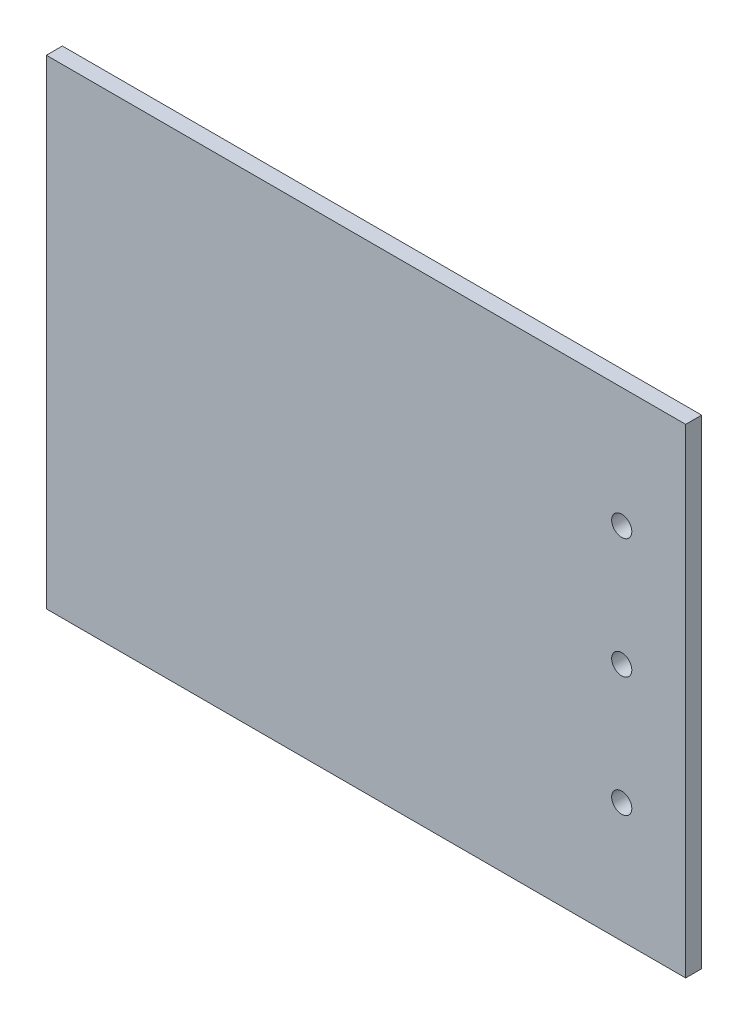
ISO-10303-21;
HEADER;
FILE_DESCRIPTION(('STEP AP214'),'2;1');
FILE_NAME('part.step','',(''),(''),'','','');
FILE_SCHEMA(('AUTOMOTIVE_DESIGN { 1 0 10303 214 1 1 1 1 }'));
ENDSEC;
DATA;
#1=APPLICATION_CONTEXT('core data for automotive mechanical design processes');
#2=APPLICATION_PROTOCOL_DEFINITION('international standard','automotive_design',2000,#1);
#3=PRODUCT_CONTEXT('',#1,'mechanical');
#4=PRODUCT('Part','Part','',(#3));
#5=PRODUCT_RELATED_PRODUCT_CATEGORY('part','',(#4));
#6=PRODUCT_DEFINITION_FORMATION('','',#4);
#7=PRODUCT_DEFINITION_CONTEXT('part definition',#1,'design');
#8=PRODUCT_DEFINITION('design','',#6,#7);
#9=PRODUCT_DEFINITION_SHAPE('','',#8);
#10=(LENGTH_UNIT() NAMED_UNIT(*) SI_UNIT(.MILLI.,.METRE.));
#11=(NAMED_UNIT(*) PLANE_ANGLE_UNIT() SI_UNIT($,.RADIAN.));
#12=(NAMED_UNIT(*) SI_UNIT($,.STERADIAN.) SOLID_ANGLE_UNIT());
#13=UNCERTAINTY_MEASURE_WITH_UNIT(LENGTH_MEASURE(1.E-05),#10,'distance_accuracy_value','');
#14=(GEOMETRIC_REPRESENTATION_CONTEXT(3) GLOBAL_UNCERTAINTY_ASSIGNED_CONTEXT((#13)) GLOBAL_UNIT_ASSIGNED_CONTEXT((#10,
#11,#12)) REPRESENTATION_CONTEXT('',''));
#15=CARTESIAN_POINT('',(0.,0.,0.));
#16=DIRECTION('',(0.,0.,1.));
#17=DIRECTION('',(1.,0.,0.));
#18=AXIS2_PLACEMENT_3D('',#15,#16,#17);
#19=CARTESIAN_POINT('',(-23.5847584963962,0.,5.));
#20=DIRECTION('',(0.,-1.,0.));
#21=DIRECTION('',(1.,0.,0.));
#22=AXIS2_PLACEMENT_3D('',#19,#20,#21);
#23=PLANE('',#22);
#24=DIRECTION('',(-1.,0.,0.));
#25=VECTOR('',#24,1.);
#26=CARTESIAN_POINT('',(-23.5847584963962,0.,0.));
#27=LINE('',#26,#25);
#28=CARTESIAN_POINT('',(-23.5847584963962,0.,0.));
#29=VERTEX_POINT('',#28);
#30=CARTESIAN_POINT('',(-223.584758496396,0.,0.));
#31=VERTEX_POINT('',#30);
#32=EDGE_CURVE('E109',#29,#31,#27,.T.);
#33=ORIENTED_EDGE('',*,*,#32,.T.);
#34=DIRECTION('',(0.,0.,-1.));
#35=VECTOR('',#34,1.);
#36=CARTESIAN_POINT('',(-223.584758496396,0.,5.));
#37=LINE('',#36,#35);
#38=CARTESIAN_POINT('',(-223.584758496396,0.,5.));
#39=VERTEX_POINT('',#38);
#40=EDGE_CURVE('E11',#39,#31,#37,.T.);
#41=ORIENTED_EDGE('',*,*,#40,.F.);
#42=DIRECTION('',(-1.,0.,0.));
#43=VECTOR('',#42,1.);
#44=CARTESIAN_POINT('',(-23.5847584963962,0.,5.));
#45=LINE('',#44,#43);
#46=CARTESIAN_POINT('',(-23.5847584963962,0.,5.));
#47=VERTEX_POINT('',#46);
#48=EDGE_CURVE('E91',#47,#39,#45,.T.);
#49=ORIENTED_EDGE('',*,*,#48,.F.);
#50=DIRECTION('',(0.,0.,-1.));
#51=VECTOR('',#50,1.);
#52=CARTESIAN_POINT('',(-23.5847584963962,0.,5.));
#53=LINE('',#52,#51);
#54=EDGE_CURVE('E56',#47,#29,#53,.T.);
#55=ORIENTED_EDGE('',*,*,#54,.T.);
#56=EDGE_LOOP('',(#33,#41,#49,#55));
#57=FACE_BOUND('',#56,.T.);
#58=ADVANCED_FACE('F39',(#57),#23,.F.);
#59=CARTESIAN_POINT('',(-223.584758496396,0.,5.));
#60=DIRECTION('',(1.,0.,0.));
#61=DIRECTION('',(0.,0.,-1.));
#62=AXIS2_PLACEMENT_3D('',#59,#60,#61);
#63=PLANE('',#62);
#64=DIRECTION('',(0.,-1.,0.));
#65=VECTOR('',#64,1.);
#66=CARTESIAN_POINT('',(-223.584758496396,0.,0.));
#67=LINE('',#66,#65);
#68=CARTESIAN_POINT('',(-223.584758496396,-150.,0.));
#69=VERTEX_POINT('',#68);
#70=EDGE_CURVE('E97',#31,#69,#67,.T.);
#71=ORIENTED_EDGE('',*,*,#70,.T.);
#72=DIRECTION('',(0.,0.,-1.));
#73=VECTOR('',#72,1.);
#74=CARTESIAN_POINT('',(-223.584758496396,-150.,5.));
#75=LINE('',#74,#73);
#76=CARTESIAN_POINT('',(-223.584758496396,-150.,5.));
#77=VERTEX_POINT('',#76);
#78=EDGE_CURVE('E48',#77,#69,#75,.T.);
#79=ORIENTED_EDGE('',*,*,#78,.F.);
#80=DIRECTION('',(0.,-1.,0.));
#81=VECTOR('',#80,1.);
#82=CARTESIAN_POINT('',(-223.584758496396,0.,5.));
#83=LINE('',#82,#81);
#84=EDGE_CURVE('E83',#39,#77,#83,.T.);
#85=ORIENTED_EDGE('',*,*,#84,.F.);
#86=ORIENTED_EDGE('',*,*,#40,.T.);
#87=EDGE_LOOP('',(#71,#79,#85,#86));
#88=FACE_BOUND('',#87,.T.);
#89=ADVANCED_FACE('F96',(#88),#63,.F.);
#90=CARTESIAN_POINT('',(-23.5847584963962,-150.,5.));
#91=DIRECTION('',(0.,-1.,0.));
#92=DIRECTION('',(1.,0.,0.));
#93=AXIS2_PLACEMENT_3D('',#90,#91,#92);
#94=PLANE('',#93);
#95=DIRECTION('',(-1.,0.,0.));
#96=VECTOR('',#95,1.);
#97=CARTESIAN_POINT('',(-23.5847584963962,-150.,0.));
#98=LINE('',#97,#96);
#99=CARTESIAN_POINT('',(-23.5847584963962,-150.,0.));
#100=VERTEX_POINT('',#99);
#101=EDGE_CURVE('E115',#100,#69,#98,.T.);
#102=ORIENTED_EDGE('',*,*,#101,.F.);
#103=DIRECTION('',(0.,0.,-1.));
#104=VECTOR('',#103,1.);
#105=CARTESIAN_POINT('',(-23.5847584963962,-150.,5.));
#106=LINE('',#105,#104);
#107=CARTESIAN_POINT('',(-23.5847584963962,-150.,5.));
#108=VERTEX_POINT('',#107);
#109=EDGE_CURVE('E71',#108,#100,#106,.T.);
#110=ORIENTED_EDGE('',*,*,#109,.F.);
#111=DIRECTION('',(-1.,0.,0.));
#112=VECTOR('',#111,1.);
#113=CARTESIAN_POINT('',(-23.5847584963962,-150.,5.));
#114=LINE('',#113,#112);
#115=EDGE_CURVE('E90',#108,#77,#114,.T.);
#116=ORIENTED_EDGE('',*,*,#115,.T.);
#117=ORIENTED_EDGE('',*,*,#78,.T.);
#118=EDGE_LOOP('',(#102,#110,#116,#117));
#119=FACE_BOUND('',#118,.T.);
#120=ADVANCED_FACE('F100',(#119),#94,.T.);
#121=CARTESIAN_POINT('',(-23.5847584963962,0.,5.));
#122=DIRECTION('',(1.,0.,0.));
#123=DIRECTION('',(0.,1.,0.));
#124=AXIS2_PLACEMENT_3D('',#121,#122,#123);
#125=PLANE('',#124);
#126=DIRECTION('',(0.,-1.,0.));
#127=VECTOR('',#126,1.);
#128=CARTESIAN_POINT('',(-23.5847584963962,0.,0.));
#129=LINE('',#128,#127);
#130=EDGE_CURVE('E117',#29,#100,#129,.T.);
#131=ORIENTED_EDGE('',*,*,#130,.F.);
#132=ORIENTED_EDGE('',*,*,#54,.F.);
#133=DIRECTION('',(0.,-1.,0.));
#134=VECTOR('',#133,1.);
#135=CARTESIAN_POINT('',(-23.5847584963962,0.,5.));
#136=LINE('',#135,#134);
#137=EDGE_CURVE('E102',#47,#108,#136,.T.);
#138=ORIENTED_EDGE('',*,*,#137,.T.);
#139=ORIENTED_EDGE('',*,*,#109,.T.);
#140=EDGE_LOOP('',(#131,#132,#138,#139));
#141=FACE_BOUND('',#140,.T.);
#142=ADVANCED_FACE('F166',(#141),#125,.T.);
#143=CARTESIAN_POINT('',(0.,0.,5.));
#144=DIRECTION('',(0.,0.,1.));
#145=DIRECTION('',(1.,0.,0.));
#146=AXIS2_PLACEMENT_3D('',#143,#144,#145);
#147=PLANE('',#146);
#148=CARTESIAN_POINT('',(-43.5847584963962,-37.4999999999999,5.));
#149=DIRECTION('',(0.,0.,-1.));
#150=DIRECTION('',(-1.,0.,0.));
#151=AXIS2_PLACEMENT_3D('',#148,#149,#150);
#152=CIRCLE('',#151,3.15);
#153=CARTESIAN_POINT('',(-46.7347584963962,-37.4999999999999,5.));
#154=VERTEX_POINT('',#153);
#155=EDGE_CURVE('E112',#154,#154,#152,.T.);
#156=ORIENTED_EDGE('',*,*,#155,.T.);
#157=EDGE_LOOP('',(#156));
#158=FACE_BOUND('',#157,.T.);
#159=CARTESIAN_POINT('',(-43.5847584963962,-74.9999999999999,5.));
#160=DIRECTION('',(0.,0.,-1.));
#161=DIRECTION('',(-1.,0.,0.));
#162=AXIS2_PLACEMENT_3D('',#159,#160,#161);
#163=CIRCLE('',#162,3.15);
#164=CARTESIAN_POINT('',(-46.7347584963962,-74.9999999999999,5.));
#165=VERTEX_POINT('',#164);
#166=EDGE_CURVE('E137',#165,#165,#163,.T.);
#167=ORIENTED_EDGE('',*,*,#166,.T.);
#168=EDGE_LOOP('',(#167));
#169=FACE_BOUND('',#168,.T.);
#170=CARTESIAN_POINT('',(-43.5847584963962,-112.5,5.));
#171=DIRECTION('',(0.,0.,-1.));
#172=DIRECTION('',(-1.,0.,0.));
#173=AXIS2_PLACEMENT_3D('',#170,#171,#172);
#174=CIRCLE('',#173,3.15);
#175=CARTESIAN_POINT('',(-46.7347584963962,-112.5,5.));
#176=VERTEX_POINT('',#175);
#177=EDGE_CURVE('E129',#176,#176,#174,.T.);
#178=ORIENTED_EDGE('',*,*,#177,.T.);
#179=EDGE_LOOP('',(#178));
#180=FACE_BOUND('',#179,.T.);
#181=ORIENTED_EDGE('',*,*,#48,.T.);
#182=ORIENTED_EDGE('',*,*,#84,.T.);
#183=ORIENTED_EDGE('',*,*,#115,.F.);
#184=ORIENTED_EDGE('',*,*,#137,.F.);
#185=EDGE_LOOP('',(#181,#182,#183,#184));
#186=FACE_BOUND('',#185,.T.);
#187=ADVANCED_FACE('F87',(#158,#169,#180,#186),#147,.T.);
#188=CARTESIAN_POINT('',(0.,0.,0.));
#189=DIRECTION('',(0.,0.,1.));
#190=DIRECTION('',(1.,0.,0.));
#191=AXIS2_PLACEMENT_3D('',#188,#189,#190);
#192=PLANE('',#191);
#193=CARTESIAN_POINT('',(-43.5847584963962,-37.4999999999999,0.));
#194=DIRECTION('',(0.,0.,-1.));
#195=DIRECTION('',(-1.,0.,0.));
#196=AXIS2_PLACEMENT_3D('',#193,#194,#195);
#197=CIRCLE('',#196,3.15);
#198=CARTESIAN_POINT('',(-46.7347584963962,-37.4999999999999,0.));
#199=VERTEX_POINT('',#198);
#200=EDGE_CURVE('E141',#199,#199,#197,.T.);
#201=ORIENTED_EDGE('',*,*,#200,.F.);
#202=EDGE_LOOP('',(#201));
#203=FACE_BOUND('',#202,.T.);
#204=CARTESIAN_POINT('',(-43.5847584963962,-74.9999999999999,0.));
#205=DIRECTION('',(0.,0.,-1.));
#206=DIRECTION('',(-1.,0.,0.));
#207=AXIS2_PLACEMENT_3D('',#204,#205,#206);
#208=CIRCLE('',#207,3.15);
#209=CARTESIAN_POINT('',(-46.7347584963962,-74.9999999999999,0.));
#210=VERTEX_POINT('',#209);
#211=EDGE_CURVE('E133',#210,#210,#208,.T.);
#212=ORIENTED_EDGE('',*,*,#211,.F.);
#213=EDGE_LOOP('',(#212));
#214=FACE_BOUND('',#213,.T.);
#215=CARTESIAN_POINT('',(-43.5847584963962,-112.5,0.));
#216=DIRECTION('',(0.,0.,-1.));
#217=DIRECTION('',(-1.,0.,0.));
#218=AXIS2_PLACEMENT_3D('',#215,#216,#217);
#219=CIRCLE('',#218,3.15);
#220=CARTESIAN_POINT('',(-46.7347584963962,-112.5,0.));
#221=VERTEX_POINT('',#220);
#222=EDGE_CURVE('E125',#221,#221,#219,.T.);
#223=ORIENTED_EDGE('',*,*,#222,.F.);
#224=EDGE_LOOP('',(#223));
#225=FACE_BOUND('',#224,.T.);
#226=ORIENTED_EDGE('',*,*,#32,.F.);
#227=ORIENTED_EDGE('',*,*,#130,.T.);
#228=ORIENTED_EDGE('',*,*,#101,.T.);
#229=ORIENTED_EDGE('',*,*,#70,.F.);
#230=EDGE_LOOP('',(#226,#227,#228,#229));
#231=FACE_BOUND('',#230,.T.);
#232=ADVANCED_FACE('F158',(#203,#214,#225,#231),#192,.F.);
#233=CARTESIAN_POINT('',(-43.5847584963962,-112.5,5.));
#234=DIRECTION('',(0.,0.,-1.));
#235=DIRECTION('',(-1.,0.,0.));
#236=AXIS2_PLACEMENT_3D('',#233,#234,#235);
#237=CYLINDRICAL_SURFACE('',#236,3.15);
#238=ORIENTED_EDGE('',*,*,#177,.F.);
#239=EDGE_LOOP('',(#238));
#240=FACE_BOUND('',#239,.T.);
#241=ORIENTED_EDGE('',*,*,#222,.T.);
#242=EDGE_LOOP('',(#241));
#243=FACE_BOUND('',#242,.T.);
#244=ADVANCED_FACE('F161',(#240,#243),#237,.F.);
#245=CARTESIAN_POINT('',(-43.5847584963962,-74.9999999999999,5.));
#246=DIRECTION('',(0.,0.,-1.));
#247=DIRECTION('',(-1.,0.,0.));
#248=AXIS2_PLACEMENT_3D('',#245,#246,#247);
#249=CYLINDRICAL_SURFACE('',#248,3.15);
#250=ORIENTED_EDGE('',*,*,#166,.F.);
#251=EDGE_LOOP('',(#250));
#252=FACE_BOUND('',#251,.T.);
#253=ORIENTED_EDGE('',*,*,#211,.T.);
#254=EDGE_LOOP('',(#253));
#255=FACE_BOUND('',#254,.T.);
#256=ADVANCED_FACE('F154',(#252,#255),#249,.F.);
#257=CARTESIAN_POINT('',(-43.5847584963962,-37.4999999999999,5.));
#258=DIRECTION('',(0.,0.,-1.));
#259=DIRECTION('',(-1.,0.,0.));
#260=AXIS2_PLACEMENT_3D('',#257,#258,#259);
#261=CYLINDRICAL_SURFACE('',#260,3.15);
#262=ORIENTED_EDGE('',*,*,#155,.F.);
#263=EDGE_LOOP('',(#262));
#264=FACE_BOUND('',#263,.T.);
#265=ORIENTED_EDGE('',*,*,#200,.T.);
#266=EDGE_LOOP('',(#265));
#267=FACE_BOUND('',#266,.T.);
#268=ADVANCED_FACE('F151',(#264,#267),#261,.F.);
#269=CLOSED_SHELL('',(#58,#89,#120,#142,#187,#232,#244,#256,#268));
#270=MANIFOLD_SOLID_BREP('B2',#269);
#271=ADVANCED_BREP_SHAPE_REPRESENTATION('',(#18,#270),#14);
#272=SHAPE_DEFINITION_REPRESENTATION(#9,#271);
ENDSEC;
END-ISO-10303-21;
